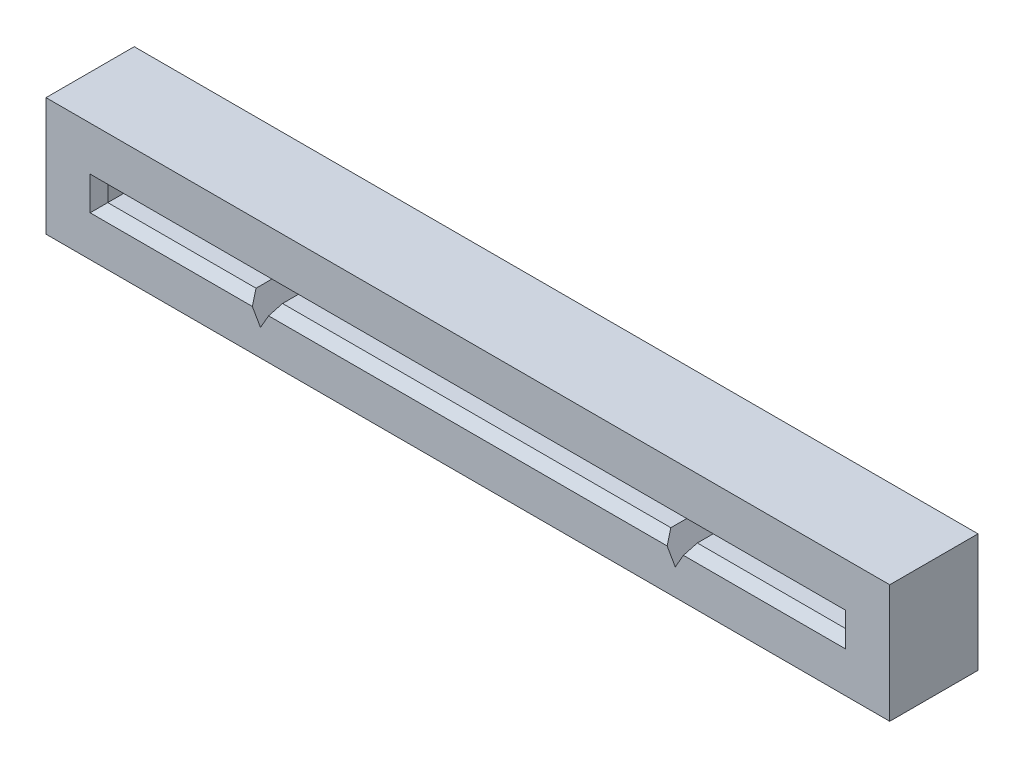
ISO-10303-21;
HEADER;
FILE_DESCRIPTION(('STEP AP214'),'2;1');
FILE_NAME('part.step','',(''),(''),'','','');
FILE_SCHEMA(('AUTOMOTIVE_DESIGN { 1 0 10303 214 1 1 1 1 }'));
ENDSEC;
DATA;
#1=APPLICATION_CONTEXT('core data for automotive mechanical design processes');
#2=APPLICATION_PROTOCOL_DEFINITION('international standard','automotive_design',2000,#1);
#3=PRODUCT_CONTEXT('',#1,'mechanical');
#4=PRODUCT('Part','Part','',(#3));
#5=PRODUCT_RELATED_PRODUCT_CATEGORY('part','',(#4));
#6=PRODUCT_DEFINITION_FORMATION('','',#4);
#7=PRODUCT_DEFINITION_CONTEXT('part definition',#1,'design');
#8=PRODUCT_DEFINITION('design','',#6,#7);
#9=PRODUCT_DEFINITION_SHAPE('','',#8);
#10=(LENGTH_UNIT() NAMED_UNIT(*) SI_UNIT(.MILLI.,.METRE.));
#11=(NAMED_UNIT(*) PLANE_ANGLE_UNIT() SI_UNIT($,.RADIAN.));
#12=(NAMED_UNIT(*) SI_UNIT($,.STERADIAN.) SOLID_ANGLE_UNIT());
#13=UNCERTAINTY_MEASURE_WITH_UNIT(LENGTH_MEASURE(1.E-05),#10,'distance_accuracy_value','');
#14=(GEOMETRIC_REPRESENTATION_CONTEXT(3) GLOBAL_UNCERTAINTY_ASSIGNED_CONTEXT((#13)) GLOBAL_UNIT_ASSIGNED_CONTEXT((#10,
#11,#12)) REPRESENTATION_CONTEXT('',''));
#15=CARTESIAN_POINT('',(0.,0.,0.));
#16=DIRECTION('',(0.,0.,1.));
#17=DIRECTION('',(1.,0.,0.));
#18=AXIS2_PLACEMENT_3D('',#15,#16,#17);
#19=CARTESIAN_POINT('',(0.,0.,5.));
#20=DIRECTION('',(0.,0.,-1.));
#21=DIRECTION('',(-1.,0.,0.));
#22=AXIS2_PLACEMENT_3D('',#19,#20,#21);
#23=PLANE('',#22);
#24=DIRECTION('',(0.499722453489569,-0.866185586048605,0.));
#25=VECTOR('',#24,1.);
#26=CARTESIAN_POINT('',(11.7499999999997,-1.75,5.));
#27=LINE('',#26,#25);
#28=CARTESIAN_POINT('',(11.2884615384613,-0.950000000000006,5.));
#29=VERTEX_POINT('',#28);
#30=CARTESIAN_POINT('',(11.7499999999997,-1.75,5.));
#31=VERTEX_POINT('',#30);
#32=EDGE_CURVE('E187',#29,#31,#27,.T.);
#33=ORIENTED_EDGE('',*,*,#32,.F.);
#34=DIRECTION('',(-1.,0.,0.));
#35=VECTOR('',#34,1.);
#36=CARTESIAN_POINT('',(-11.0000000000002,-0.950000000000006,5.));
#37=LINE('',#36,#35);
#38=CARTESIAN_POINT('',(-11.2884615384618,-0.950000000000007,5.));
#39=VERTEX_POINT('',#38);
#40=EDGE_CURVE('E186',#29,#39,#37,.T.);
#41=ORIENTED_EDGE('',*,*,#40,.T.);
#42=DIRECTION('',(0.499722453489584,0.866185586048597,0.));
#43=VECTOR('',#42,1.);
#44=CARTESIAN_POINT('',(-11.0000000000002,-0.450000000000006,5.));
#45=LINE('',#44,#43);
#46=CARTESIAN_POINT('',(-11.7500000000003,-1.75,5.));
#47=VERTEX_POINT('',#46);
#48=EDGE_CURVE('E170',#47,#39,#45,.T.);
#49=ORIENTED_EDGE('',*,*,#48,.F.);
#50=DIRECTION('',(0.499722453489585,-0.866185586048596,0.));
#51=VECTOR('',#50,1.);
#52=CARTESIAN_POINT('',(-11.7500000000003,-1.75,5.));
#53=LINE('',#52,#51);
#54=CARTESIAN_POINT('',(-12.2115384615387,-0.950000000000006,5.));
#55=VERTEX_POINT('',#54);
#56=EDGE_CURVE('E159',#55,#47,#53,.T.);
#57=ORIENTED_EDGE('',*,*,#56,.F.);
#58=DIRECTION('',(-1.,0.,0.));
#59=VECTOR('',#58,1.);
#60=CARTESIAN_POINT('',(-20.9000000000005,-0.950000000000006,5.));
#61=LINE('',#60,#59);
#62=CARTESIAN_POINT('',(-21.4000000000005,-0.950000000000006,5.));
#63=VERTEX_POINT('',#62);
#64=EDGE_CURVE('E279',#55,#63,#61,.T.);
#65=ORIENTED_EDGE('',*,*,#64,.T.);
#66=DIRECTION('',(0.,1.,0.));
#67=VECTOR('',#66,1.);
#68=CARTESIAN_POINT('',(-21.4000000000005,0.44999999999999,5.));
#69=LINE('',#68,#67);
#70=CARTESIAN_POINT('',(-21.4000000000005,0.949999999999993,5.));
#71=VERTEX_POINT('',#70);
#72=EDGE_CURVE('E277',#63,#71,#69,.T.);
#73=ORIENTED_EDGE('',*,*,#72,.T.);
#74=DIRECTION('',(1.,0.,0.));
#75=VECTOR('',#74,1.);
#76=CARTESIAN_POINT('',(20.8999999999995,0.949999999999993,5.));
#77=LINE('',#76,#75);
#78=CARTESIAN_POINT('',(21.3999999999995,0.949999999999993,5.));
#79=VERTEX_POINT('',#78);
#80=EDGE_CURVE('E271',#71,#79,#77,.T.);
#81=ORIENTED_EDGE('',*,*,#80,.T.);
#82=DIRECTION('',(0.,-1.,0.));
#83=VECTOR('',#82,1.);
#84=CARTESIAN_POINT('',(21.3999999999995,-0.449999999999992,5.));
#85=LINE('',#84,#83);
#86=CARTESIAN_POINT('',(21.3999999999995,-0.949999999999993,5.));
#87=VERTEX_POINT('',#86);
#88=EDGE_CURVE('E273',#79,#87,#85,.T.);
#89=ORIENTED_EDGE('',*,*,#88,.T.);
#90=DIRECTION('',(-1.,0.,0.));
#91=VECTOR('',#90,1.);
#92=CARTESIAN_POINT('',(12.4999999999998,-0.949999999999993,5.));
#93=LINE('',#92,#91);
#94=CARTESIAN_POINT('',(12.2115384615382,-0.949999999999993,5.));
#95=VERTEX_POINT('',#94);
#96=EDGE_CURVE('E275',#87,#95,#93,.T.);
#97=ORIENTED_EDGE('',*,*,#96,.T.);
#98=DIRECTION('',(0.499722453489582,0.866185586048597,0.));
#99=VECTOR('',#98,1.);
#100=CARTESIAN_POINT('',(12.4999999999998,-0.449999999999992,5.));
#101=LINE('',#100,#99);
#102=EDGE_CURVE('E171',#31,#95,#101,.T.);
#103=ORIENTED_EDGE('',*,*,#102,.F.);
#104=EDGE_LOOP('',(#33,#41,#49,#57,#65,#73,#81,#89,#97,#103));
#105=FACE_BOUND('',#104,.T.);
#106=DIRECTION('',(0.,-1.,0.));
#107=VECTOR('',#106,1.);
#108=CARTESIAN_POINT('',(-23.8999999999999,3.44999999999999,5.));
#109=LINE('',#108,#107);
#110=CARTESIAN_POINT('',(-23.8999999999999,3.44999999999999,5.));
#111=VERTEX_POINT('',#110);
#112=CARTESIAN_POINT('',(-23.8999999999999,-3.24999999999999,5.));
#113=VERTEX_POINT('',#112);
#114=EDGE_CURVE('E237',#111,#113,#109,.T.);
#115=ORIENTED_EDGE('',*,*,#114,.T.);
#116=DIRECTION('',(1.,0.,0.));
#117=VECTOR('',#116,1.);
#118=CARTESIAN_POINT('',(23.8999999999995,-3.24999999999999,5.));
#119=LINE('',#118,#117);
#120=CARTESIAN_POINT('',(23.8999999999995,-3.24999999999999,5.));
#121=VERTEX_POINT('',#120);
#122=EDGE_CURVE('E240',#113,#121,#119,.T.);
#123=ORIENTED_EDGE('',*,*,#122,.T.);
#124=DIRECTION('',(0.,1.,0.));
#125=VECTOR('',#124,1.);
#126=CARTESIAN_POINT('',(23.8999999999995,3.44999999999999,5.));
#127=LINE('',#126,#125);
#128=CARTESIAN_POINT('',(23.8999999999995,3.44999999999999,5.));
#129=VERTEX_POINT('',#128);
#130=EDGE_CURVE('E243',#121,#129,#127,.T.);
#131=ORIENTED_EDGE('',*,*,#130,.T.);
#132=DIRECTION('',(-1.,0.,0.));
#133=VECTOR('',#132,1.);
#134=CARTESIAN_POINT('',(23.8999999999995,3.44999999999999,5.));
#135=LINE('',#134,#133);
#136=EDGE_CURVE('E245',#129,#111,#135,.T.);
#137=ORIENTED_EDGE('',*,*,#136,.T.);
#138=EDGE_LOOP('',(#115,#123,#131,#137));
#139=FACE_BOUND('',#138,.T.);
#140=ADVANCED_FACE('F34',(#105,#139),#23,.F.);
#141=CARTESIAN_POINT('',(0.,0.,0.));
#142=DIRECTION('',(0.,0.,-1.));
#143=DIRECTION('',(-1.,0.,0.));
#144=AXIS2_PLACEMENT_3D('',#141,#142,#143);
#145=PLANE('',#144);
#146=DIRECTION('',(0.,-1.,0.));
#147=VECTOR('',#146,1.);
#148=CARTESIAN_POINT('',(-23.8999999999999,3.44999999999999,0.));
#149=LINE('',#148,#147);
#150=CARTESIAN_POINT('',(-23.8999999999999,3.44999999999999,0.));
#151=VERTEX_POINT('',#150);
#152=CARTESIAN_POINT('',(-23.8999999999999,-3.24999999999999,0.));
#153=VERTEX_POINT('',#152);
#154=EDGE_CURVE('E236',#151,#153,#149,.T.);
#155=ORIENTED_EDGE('',*,*,#154,.F.);
#156=DIRECTION('',(-1.,0.,0.));
#157=VECTOR('',#156,1.);
#158=CARTESIAN_POINT('',(23.8999999999995,3.44999999999999,0.));
#159=LINE('',#158,#157);
#160=CARTESIAN_POINT('',(23.8999999999995,3.44999999999999,0.));
#161=VERTEX_POINT('',#160);
#162=EDGE_CURVE('E241',#161,#151,#159,.T.);
#163=ORIENTED_EDGE('',*,*,#162,.F.);
#164=DIRECTION('',(0.,1.,0.));
#165=VECTOR('',#164,1.);
#166=CARTESIAN_POINT('',(23.8999999999995,3.44999999999999,0.));
#167=LINE('',#166,#165);
#168=CARTESIAN_POINT('',(23.8999999999995,-3.24999999999999,0.));
#169=VERTEX_POINT('',#168);
#170=EDGE_CURVE('E252',#169,#161,#167,.T.);
#171=ORIENTED_EDGE('',*,*,#170,.F.);
#172=DIRECTION('',(1.,0.,0.));
#173=VECTOR('',#172,1.);
#174=CARTESIAN_POINT('',(23.8999999999995,-3.24999999999999,0.));
#175=LINE('',#174,#173);
#176=EDGE_CURVE('E250',#153,#169,#175,.T.);
#177=ORIENTED_EDGE('',*,*,#176,.F.);
#178=EDGE_LOOP('',(#155,#163,#171,#177));
#179=FACE_BOUND('',#178,.T.);
#180=DIRECTION('',(0.499722453489569,-0.866185586048605,0.));
#181=VECTOR('',#180,1.);
#182=CARTESIAN_POINT('',(11.7499999999997,-1.75,0.));
#183=LINE('',#182,#181);
#184=CARTESIAN_POINT('',(10.9999999999998,-0.450000000000006,0.));
#185=VERTEX_POINT('',#184);
#186=CARTESIAN_POINT('',(11.7499999999997,-1.75,0.));
#187=VERTEX_POINT('',#186);
#188=EDGE_CURVE('E217',#185,#187,#183,.T.);
#189=ORIENTED_EDGE('',*,*,#188,.T.);
#190=DIRECTION('',(0.499722453489582,0.866185586048597,0.));
#191=VECTOR('',#190,1.);
#192=CARTESIAN_POINT('',(12.4999999999998,-0.449999999999992,0.));
#193=LINE('',#192,#191);
#194=CARTESIAN_POINT('',(12.4999999999998,-0.449999999999992,0.));
#195=VERTEX_POINT('',#194);
#196=EDGE_CURVE('E193',#187,#195,#193,.T.);
#197=ORIENTED_EDGE('',*,*,#196,.T.);
#198=DIRECTION('',(1.,0.,0.));
#199=VECTOR('',#198,1.);
#200=CARTESIAN_POINT('',(20.8999999999995,-0.449999999999992,0.));
#201=LINE('',#200,#199);
#202=CARTESIAN_POINT('',(20.8999999999995,-0.449999999999992,0.));
#203=VERTEX_POINT('',#202);
#204=EDGE_CURVE('E196',#195,#203,#201,.T.);
#205=ORIENTED_EDGE('',*,*,#204,.T.);
#206=DIRECTION('',(0.,1.,0.));
#207=VECTOR('',#206,1.);
#208=CARTESIAN_POINT('',(20.8999999999995,-0.449999999999992,0.));
#209=LINE('',#208,#207);
#210=CARTESIAN_POINT('',(20.8999999999995,0.449999999999992,0.));
#211=VERTEX_POINT('',#210);
#212=EDGE_CURVE('E199',#203,#211,#209,.T.);
#213=ORIENTED_EDGE('',*,*,#212,.T.);
#214=DIRECTION('',(-1.,0.,0.));
#215=VECTOR('',#214,1.);
#216=CARTESIAN_POINT('',(20.8999999999995,0.449999999999992,0.));
#217=LINE('',#216,#215);
#218=CARTESIAN_POINT('',(-20.9000000000005,0.449999999999992,0.));
#219=VERTEX_POINT('',#218);
#220=EDGE_CURVE('E202',#211,#219,#217,.T.);
#221=ORIENTED_EDGE('',*,*,#220,.T.);
#222=DIRECTION('',(0.,-1.,0.));
#223=VECTOR('',#222,1.);
#224=CARTESIAN_POINT('',(-20.9000000000005,-0.450000000000006,0.));
#225=LINE('',#224,#223);
#226=CARTESIAN_POINT('',(-20.9000000000005,-0.450000000000006,0.));
#227=VERTEX_POINT('',#226);
#228=EDGE_CURVE('E205',#219,#227,#225,.T.);
#229=ORIENTED_EDGE('',*,*,#228,.T.);
#230=DIRECTION('',(1.,0.,0.));
#231=VECTOR('',#230,1.);
#232=CARTESIAN_POINT('',(-12.5000000000003,-0.450000000000006,0.));
#233=LINE('',#232,#231);
#234=CARTESIAN_POINT('',(-12.5000000000003,-0.450000000000006,0.));
#235=VERTEX_POINT('',#234);
#236=EDGE_CURVE('E208',#227,#235,#233,.T.);
#237=ORIENTED_EDGE('',*,*,#236,.T.);
#238=DIRECTION('',(0.499722453489585,-0.866185586048596,0.));
#239=VECTOR('',#238,1.);
#240=CARTESIAN_POINT('',(-11.7500000000003,-1.75,0.));
#241=LINE('',#240,#239);
#242=CARTESIAN_POINT('',(-11.7500000000003,-1.75,0.));
#243=VERTEX_POINT('',#242);
#244=EDGE_CURVE('E211',#235,#243,#241,.T.);
#245=ORIENTED_EDGE('',*,*,#244,.T.);
#246=DIRECTION('',(0.499722453489584,0.866185586048597,0.));
#247=VECTOR('',#246,1.);
#248=CARTESIAN_POINT('',(-11.0000000000002,-0.450000000000006,0.));
#249=LINE('',#248,#247);
#250=CARTESIAN_POINT('',(-11.0000000000002,-0.450000000000006,0.));
#251=VERTEX_POINT('',#250);
#252=EDGE_CURVE('E178',#243,#251,#249,.T.);
#253=ORIENTED_EDGE('',*,*,#252,.T.);
#254=DIRECTION('',(1.,0.,0.));
#255=VECTOR('',#254,1.);
#256=CARTESIAN_POINT('',(10.9999999999998,-0.450000000000006,0.));
#257=LINE('',#256,#255);
#258=EDGE_CURVE('E214',#251,#185,#257,.T.);
#259=ORIENTED_EDGE('',*,*,#258,.T.);
#260=EDGE_LOOP('',(#189,#197,#205,#213,#221,#229,#237,#245,#253,#259));
#261=FACE_BOUND('',#260,.T.);
#262=ADVANCED_FACE('F323',(#179,#261),#145,.T.);
#263=CARTESIAN_POINT('',(-23.8999999999999,3.44999999999999,5.));
#264=DIRECTION('',(1.,0.,0.));
#265=DIRECTION('',(0.,0.,-1.));
#266=AXIS2_PLACEMENT_3D('',#263,#264,#265);
#267=PLANE('',#266);
#268=ORIENTED_EDGE('',*,*,#154,.T.);
#269=DIRECTION('',(0.,0.,-1.));
#270=VECTOR('',#269,1.);
#271=CARTESIAN_POINT('',(-23.8999999999999,-3.24999999999999,5.));
#272=LINE('',#271,#270);
#273=EDGE_CURVE('E263',#113,#153,#272,.T.);
#274=ORIENTED_EDGE('',*,*,#273,.F.);
#275=ORIENTED_EDGE('',*,*,#114,.F.);
#276=DIRECTION('',(0.,0.,-1.));
#277=VECTOR('',#276,1.);
#278=CARTESIAN_POINT('',(-23.8999999999999,3.44999999999999,5.));
#279=LINE('',#278,#277);
#280=EDGE_CURVE('E247',#111,#151,#279,.T.);
#281=ORIENTED_EDGE('',*,*,#280,.T.);
#282=EDGE_LOOP('',(#268,#274,#275,#281));
#283=FACE_BOUND('',#282,.T.);
#284=ADVANCED_FACE('F345',(#283),#267,.F.);
#285=CARTESIAN_POINT('',(23.8999999999995,-3.24999999999999,5.));
#286=DIRECTION('',(0.,1.,0.));
#287=DIRECTION('',(0.,0.,1.));
#288=AXIS2_PLACEMENT_3D('',#285,#286,#287);
#289=PLANE('',#288);
#290=ORIENTED_EDGE('',*,*,#176,.T.);
#291=DIRECTION('',(0.,0.,-1.));
#292=VECTOR('',#291,1.);
#293=CARTESIAN_POINT('',(23.8999999999995,-3.24999999999999,5.));
#294=LINE('',#293,#292);
#295=EDGE_CURVE('E260',#121,#169,#294,.T.);
#296=ORIENTED_EDGE('',*,*,#295,.F.);
#297=ORIENTED_EDGE('',*,*,#122,.F.);
#298=ORIENTED_EDGE('',*,*,#273,.T.);
#299=EDGE_LOOP('',(#290,#296,#297,#298));
#300=FACE_BOUND('',#299,.T.);
#301=ADVANCED_FACE('F358',(#300),#289,.F.);
#302=CARTESIAN_POINT('',(23.8999999999995,3.44999999999999,5.));
#303=DIRECTION('',(-1.,0.,0.));
#304=DIRECTION('',(0.,0.,1.));
#305=AXIS2_PLACEMENT_3D('',#302,#303,#304);
#306=PLANE('',#305);
#307=ORIENTED_EDGE('',*,*,#170,.T.);
#308=DIRECTION('',(0.,0.,-1.));
#309=VECTOR('',#308,1.);
#310=CARTESIAN_POINT('',(23.8999999999995,3.44999999999999,5.));
#311=LINE('',#310,#309);
#312=EDGE_CURVE('E257',#129,#161,#311,.T.);
#313=ORIENTED_EDGE('',*,*,#312,.F.);
#314=ORIENTED_EDGE('',*,*,#130,.F.);
#315=ORIENTED_EDGE('',*,*,#295,.T.);
#316=EDGE_LOOP('',(#307,#313,#314,#315));
#317=FACE_BOUND('',#316,.T.);
#318=ADVANCED_FACE('F354',(#317),#306,.F.);
#319=CARTESIAN_POINT('',(23.8999999999995,3.44999999999999,5.));
#320=DIRECTION('',(0.,-1.,0.));
#321=DIRECTION('',(0.,0.,-1.));
#322=AXIS2_PLACEMENT_3D('',#319,#320,#321);
#323=PLANE('',#322);
#324=ORIENTED_EDGE('',*,*,#162,.T.);
#325=ORIENTED_EDGE('',*,*,#280,.F.);
#326=ORIENTED_EDGE('',*,*,#136,.F.);
#327=ORIENTED_EDGE('',*,*,#312,.T.);
#328=EDGE_LOOP('',(#324,#325,#326,#327));
#329=FACE_BOUND('',#328,.T.);
#330=ADVANCED_FACE('F351',(#329),#323,.F.);
#331=CARTESIAN_POINT('',(12.4999999999998,-0.449999999999992,5.));
#332=DIRECTION('',(-0.866185586048597,0.499722453489583,0.));
#333=DIRECTION('',(-0.499722453489583,-0.866185586048597,0.));
#334=AXIS2_PLACEMENT_3D('',#331,#332,#333);
#335=PLANE('',#334);
#336=ORIENTED_EDGE('',*,*,#102,.T.);
#337=DIRECTION('',(0.377724723874414,0.654722854715641,-0.654722854715641));
#338=VECTOR('',#337,1.);
#339=CARTESIAN_POINT('',(12.3763474952439,-0.664331008243492,4.7143310082435));
#340=LINE('',#339,#338);
#341=CARTESIAN_POINT('',(12.4999999999998,-0.449999999999992,4.5));
#342=VERTEX_POINT('',#341);
#343=EDGE_CURVE('E291',#95,#342,#340,.T.);
#344=ORIENTED_EDGE('',*,*,#343,.T.);
#345=DIRECTION('',(0.,0.,-1.));
#346=VECTOR('',#345,1.);
#347=CARTESIAN_POINT('',(12.4999999999998,-0.449999999999992,5.));
#348=LINE('',#347,#346);
#349=EDGE_CURVE('E234',#342,#195,#348,.T.);
#350=ORIENTED_EDGE('',*,*,#349,.T.);
#351=ORIENTED_EDGE('',*,*,#196,.F.);
#352=DIRECTION('',(0.,0.,-1.));
#353=VECTOR('',#352,1.);
#354=CARTESIAN_POINT('',(11.7499999999997,-1.75,5.));
#355=LINE('',#354,#353);
#356=EDGE_CURVE('E189',#31,#187,#355,.T.);
#357=ORIENTED_EDGE('',*,*,#356,.F.);
#358=EDGE_LOOP('',(#336,#344,#350,#351,#357));
#359=FACE_BOUND('',#358,.T.);
#360=ADVANCED_FACE('F317',(#359),#335,.T.);
#361=CARTESIAN_POINT('',(20.8999999999995,-0.449999999999992,5.));
#362=DIRECTION('',(0.,1.,0.));
#363=DIRECTION('',(0.,0.,1.));
#364=AXIS2_PLACEMENT_3D('',#361,#362,#363);
#365=PLANE('',#364);
#366=ORIENTED_EDGE('',*,*,#349,.F.);
#367=DIRECTION('',(1.,0.,0.));
#368=VECTOR('',#367,1.);
#369=CARTESIAN_POINT('',(20.8999999999995,-0.449999999999992,4.5));
#370=LINE('',#369,#368);
#371=CARTESIAN_POINT('',(20.8999999999995,-0.449999999999992,4.5));
#372=VERTEX_POINT('',#371);
#373=EDGE_CURVE('E58',#342,#372,#370,.T.);
#374=ORIENTED_EDGE('',*,*,#373,.T.);
#375=DIRECTION('',(0.,0.,-1.));
#376=VECTOR('',#375,1.);
#377=CARTESIAN_POINT('',(20.8999999999995,-0.449999999999992,5.));
#378=LINE('',#377,#376);
#379=EDGE_CURVE('E232',#372,#203,#378,.T.);
#380=ORIENTED_EDGE('',*,*,#379,.T.);
#381=ORIENTED_EDGE('',*,*,#204,.F.);
#382=EDGE_LOOP('',(#366,#374,#380,#381));
#383=FACE_BOUND('',#382,.T.);
#384=ADVANCED_FACE('F396',(#383),#365,.T.);
#385=CARTESIAN_POINT('',(20.8999999999995,-0.449999999999992,5.));
#386=DIRECTION('',(-1.,0.,0.));
#387=DIRECTION('',(0.,0.,1.));
#388=AXIS2_PLACEMENT_3D('',#385,#386,#387);
#389=PLANE('',#388);
#390=ORIENTED_EDGE('',*,*,#379,.F.);
#391=DIRECTION('',(0.,1.,0.));
#392=VECTOR('',#391,1.);
#393=CARTESIAN_POINT('',(20.8999999999995,0.449999999999992,4.5));
#394=LINE('',#393,#392);
#395=CARTESIAN_POINT('',(20.8999999999995,0.449999999999992,4.5));
#396=VERTEX_POINT('',#395);
#397=EDGE_CURVE('E43',#372,#396,#394,.T.);
#398=ORIENTED_EDGE('',*,*,#397,.T.);
#399=DIRECTION('',(0.,0.,-1.));
#400=VECTOR('',#399,1.);
#401=CARTESIAN_POINT('',(20.8999999999995,0.449999999999992,5.));
#402=LINE('',#401,#400);
#403=EDGE_CURVE('E230',#396,#211,#402,.T.);
#404=ORIENTED_EDGE('',*,*,#403,.T.);
#405=ORIENTED_EDGE('',*,*,#212,.F.);
#406=EDGE_LOOP('',(#390,#398,#404,#405));
#407=FACE_BOUND('',#406,.T.);
#408=ADVANCED_FACE('F402',(#407),#389,.T.);
#409=CARTESIAN_POINT('',(20.8999999999995,0.449999999999992,5.));
#410=DIRECTION('',(0.,-1.,0.));
#411=DIRECTION('',(0.,0.,-1.));
#412=AXIS2_PLACEMENT_3D('',#409,#410,#411);
#413=PLANE('',#412);
#414=ORIENTED_EDGE('',*,*,#403,.F.);
#415=DIRECTION('',(-1.,0.,0.));
#416=VECTOR('',#415,1.);
#417=CARTESIAN_POINT('',(-20.9000000000005,0.449999999999992,4.5));
#418=LINE('',#417,#416);
#419=CARTESIAN_POINT('',(-20.9000000000005,0.449999999999992,4.5));
#420=VERTEX_POINT('',#419);
#421=EDGE_CURVE('E11',#396,#420,#418,.T.);
#422=ORIENTED_EDGE('',*,*,#421,.T.);
#423=DIRECTION('',(0.,0.,-1.));
#424=VECTOR('',#423,1.);
#425=CARTESIAN_POINT('',(-20.9000000000005,0.449999999999992,5.));
#426=LINE('',#425,#424);
#427=EDGE_CURVE('E228',#420,#219,#426,.T.);
#428=ORIENTED_EDGE('',*,*,#427,.T.);
#429=ORIENTED_EDGE('',*,*,#220,.F.);
#430=EDGE_LOOP('',(#414,#422,#428,#429));
#431=FACE_BOUND('',#430,.T.);
#432=ADVANCED_FACE('F408',(#431),#413,.T.);
#433=CARTESIAN_POINT('',(-20.9000000000005,-0.450000000000006,5.));
#434=DIRECTION('',(1.,0.,0.));
#435=DIRECTION('',(0.,1.,0.));
#436=AXIS2_PLACEMENT_3D('',#433,#434,#435);
#437=PLANE('',#436);
#438=ORIENTED_EDGE('',*,*,#427,.F.);
#439=DIRECTION('',(0.,-1.,0.));
#440=VECTOR('',#439,1.);
#441=CARTESIAN_POINT('',(-20.9000000000005,-0.450000000000006,4.5));
#442=LINE('',#441,#440);
#443=CARTESIAN_POINT('',(-20.9000000000005,-0.450000000000006,4.5));
#444=VERTEX_POINT('',#443);
#445=EDGE_CURVE('E288',#420,#444,#442,.T.);
#446=ORIENTED_EDGE('',*,*,#445,.T.);
#447=DIRECTION('',(0.,0.,-1.));
#448=VECTOR('',#447,1.);
#449=CARTESIAN_POINT('',(-20.9000000000005,-0.450000000000006,5.));
#450=LINE('',#449,#448);
#451=EDGE_CURVE('E226',#444,#227,#450,.T.);
#452=ORIENTED_EDGE('',*,*,#451,.T.);
#453=ORIENTED_EDGE('',*,*,#228,.F.);
#454=EDGE_LOOP('',(#438,#446,#452,#453));
#455=FACE_BOUND('',#454,.T.);
#456=ADVANCED_FACE('F415',(#455),#437,.T.);
#457=CARTESIAN_POINT('',(-12.5000000000003,-0.450000000000006,5.));
#458=DIRECTION('',(0.,1.,0.));
#459=DIRECTION('',(0.,0.,1.));
#460=AXIS2_PLACEMENT_3D('',#457,#458,#459);
#461=PLANE('',#460);
#462=ORIENTED_EDGE('',*,*,#451,.F.);
#463=DIRECTION('',(1.,0.,0.));
#464=VECTOR('',#463,1.);
#465=CARTESIAN_POINT('',(-12.5000000000003,-0.450000000000006,4.5));
#466=LINE('',#465,#464);
#467=CARTESIAN_POINT('',(-12.5000000000003,-0.450000000000006,4.5));
#468=VERTEX_POINT('',#467);
#469=EDGE_CURVE('E284',#444,#468,#466,.T.);
#470=ORIENTED_EDGE('',*,*,#469,.T.);
#471=DIRECTION('',(0.,0.,-1.));
#472=VECTOR('',#471,1.);
#473=CARTESIAN_POINT('',(-12.5000000000003,-0.450000000000006,5.));
#474=LINE('',#473,#472);
#475=EDGE_CURVE('E180',#468,#235,#474,.T.);
#476=ORIENTED_EDGE('',*,*,#475,.T.);
#477=ORIENTED_EDGE('',*,*,#236,.F.);
#478=EDGE_LOOP('',(#462,#470,#476,#477));
#479=FACE_BOUND('',#478,.T.);
#480=ADVANCED_FACE('F423',(#479),#461,.T.);
#481=CARTESIAN_POINT('',(-11.7500000000003,-1.75,5.));
#482=DIRECTION('',(0.866185586048596,0.499722453489585,0.));
#483=DIRECTION('',(-0.499722453489585,0.866185586048596,0.));
#484=AXIS2_PLACEMENT_3D('',#481,#482,#483);
#485=PLANE('',#484);
#486=ORIENTED_EDGE('',*,*,#475,.F.);
#487=DIRECTION('',(0.377724723874416,-0.654722854715641,0.654722854715641));
#488=VECTOR('',#487,1.);
#489=CARTESIAN_POINT('',(-11.9478440076096,-1.40707038681041,5.4570703868104));
#490=LINE('',#489,#488);
#491=EDGE_CURVE('E166',#468,#55,#490,.T.);
#492=ORIENTED_EDGE('',*,*,#491,.T.);
#493=ORIENTED_EDGE('',*,*,#56,.T.);
#494=DIRECTION('',(0.,0.,-1.));
#495=VECTOR('',#494,1.);
#496=CARTESIAN_POINT('',(-11.7500000000003,-1.75,5.));
#497=LINE('',#496,#495);
#498=EDGE_CURVE('E164',#47,#243,#497,.T.);
#499=ORIENTED_EDGE('',*,*,#498,.T.);
#500=ORIENTED_EDGE('',*,*,#244,.F.);
#501=EDGE_LOOP('',(#486,#492,#493,#499,#500));
#502=FACE_BOUND('',#501,.T.);
#503=ADVANCED_FACE('F162',(#502),#485,.T.);
#504=CARTESIAN_POINT('',(-11.0000000000002,-0.450000000000006,5.));
#505=DIRECTION('',(-0.866185586048597,0.499722453489584,0.));
#506=DIRECTION('',(-0.499722453489584,-0.866185586048597,0.));
#507=AXIS2_PLACEMENT_3D('',#504,#505,#506);
#508=PLANE('',#507);
#509=ORIENTED_EDGE('',*,*,#48,.T.);
#510=DIRECTION('',(0.377724723874415,0.654722854715641,-0.654722854715641));
#511=VECTOR('',#510,1.);
#512=CARTESIAN_POINT('',(-11.1236525047561,-0.664331008243505,4.7143310082435));
#513=LINE('',#512,#511);
#514=CARTESIAN_POINT('',(-11.0000000000002,-0.450000000000006,4.5));
#515=VERTEX_POINT('',#514);
#516=EDGE_CURVE('E282',#39,#515,#513,.T.);
#517=ORIENTED_EDGE('',*,*,#516,.T.);
#518=DIRECTION('',(0.,0.,-1.));
#519=VECTOR('',#518,1.);
#520=CARTESIAN_POINT('',(-11.0000000000002,-0.450000000000006,5.));
#521=LINE('',#520,#519);
#522=EDGE_CURVE('E181',#515,#251,#521,.T.);
#523=ORIENTED_EDGE('',*,*,#522,.T.);
#524=ORIENTED_EDGE('',*,*,#252,.F.);
#525=ORIENTED_EDGE('',*,*,#498,.F.);
#526=EDGE_LOOP('',(#509,#517,#523,#524,#525));
#527=FACE_BOUND('',#526,.T.);
#528=ADVANCED_FACE('F175',(#527),#508,.T.);
#529=CARTESIAN_POINT('',(10.9999999999998,-0.450000000000006,5.));
#530=DIRECTION('',(0.,1.,0.));
#531=DIRECTION('',(0.,0.,1.));
#532=AXIS2_PLACEMENT_3D('',#529,#530,#531);
#533=PLANE('',#532);
#534=ORIENTED_EDGE('',*,*,#522,.F.);
#535=DIRECTION('',(1.,0.,0.));
#536=VECTOR('',#535,1.);
#537=CARTESIAN_POINT('',(10.9999999999998,-0.450000000000006,4.5));
#538=LINE('',#537,#536);
#539=CARTESIAN_POINT('',(10.9999999999998,-0.450000000000006,4.5));
#540=VERTEX_POINT('',#539);
#541=EDGE_CURVE('E266',#515,#540,#538,.T.);
#542=ORIENTED_EDGE('',*,*,#541,.T.);
#543=DIRECTION('',(0.,0.,-1.));
#544=VECTOR('',#543,1.);
#545=CARTESIAN_POINT('',(10.9999999999998,-0.450000000000006,5.));
#546=LINE('',#545,#544);
#547=EDGE_CURVE('E222',#540,#185,#546,.T.);
#548=ORIENTED_EDGE('',*,*,#547,.T.);
#549=ORIENTED_EDGE('',*,*,#258,.F.);
#550=EDGE_LOOP('',(#534,#542,#548,#549));
#551=FACE_BOUND('',#550,.T.);
#552=ADVANCED_FACE('F327',(#551),#533,.T.);
#553=CARTESIAN_POINT('',(11.7499999999997,-1.75,5.));
#554=DIRECTION('',(0.866185586048605,0.499722453489569,0.));
#555=DIRECTION('',(-0.499722453489569,0.866185586048605,0.));
#556=AXIS2_PLACEMENT_3D('',#553,#554,#555);
#557=PLANE('',#556);
#558=ORIENTED_EDGE('',*,*,#547,.F.);
#559=DIRECTION('',(0.377724723874402,-0.654722854715645,0.654722854715645));
#560=VECTOR('',#559,1.);
#561=CARTESIAN_POINT('',(11.5521559923904,-1.4070703868104,5.4570703868104));
#562=LINE('',#561,#560);
#563=EDGE_CURVE('E269',#540,#29,#562,.T.);
#564=ORIENTED_EDGE('',*,*,#563,.T.);
#565=ORIENTED_EDGE('',*,*,#32,.T.);
#566=ORIENTED_EDGE('',*,*,#356,.T.);
#567=ORIENTED_EDGE('',*,*,#188,.F.);
#568=EDGE_LOOP('',(#558,#564,#565,#566,#567));
#569=FACE_BOUND('',#568,.T.);
#570=ADVANCED_FACE('F321',(#569),#557,.T.);
#571=CARTESIAN_POINT('',(10.9999999999998,-0.450000000000006,4.5));
#572=DIRECTION('',(0.,0.707106781186547,0.707106781186547));
#573=DIRECTION('',(-1.,0.,0.));
#574=AXIS2_PLACEMENT_3D('',#571,#572,#573);
#575=PLANE('',#574);
#576=ORIENTED_EDGE('',*,*,#516,.F.);
#577=ORIENTED_EDGE('',*,*,#40,.F.);
#578=ORIENTED_EDGE('',*,*,#563,.F.);
#579=ORIENTED_EDGE('',*,*,#541,.F.);
#580=EDGE_LOOP('',(#576,#577,#578,#579));
#581=FACE_BOUND('',#580,.T.);
#582=ADVANCED_FACE('F330',(#581),#575,.T.);
#583=CARTESIAN_POINT('',(20.8999999999995,-0.449999999999992,4.5));
#584=DIRECTION('',(0.,0.707106781186547,0.707106781186547));
#585=DIRECTION('',(-1.,0.,0.));
#586=AXIS2_PLACEMENT_3D('',#583,#584,#585);
#587=PLANE('',#586);
#588=ORIENTED_EDGE('',*,*,#343,.F.);
#589=ORIENTED_EDGE('',*,*,#96,.F.);
#590=DIRECTION('',(0.577350269189626,-0.577350269189626,0.577350269189626));
#591=VECTOR('',#590,1.);
#592=CARTESIAN_POINT('',(20.8999999999995,-0.449999999999992,4.5));
#593=LINE('',#592,#591);
#594=EDGE_CURVE('E38',#372,#87,#593,.T.);
#595=ORIENTED_EDGE('',*,*,#594,.F.);
#596=ORIENTED_EDGE('',*,*,#373,.F.);
#597=EDGE_LOOP('',(#588,#589,#595,#596));
#598=FACE_BOUND('',#597,.T.);
#599=ADVANCED_FACE('F36',(#598),#587,.T.);
#600=CARTESIAN_POINT('',(20.8999999999995,-0.449999999999992,4.5));
#601=DIRECTION('',(-0.707106781186547,0.,0.707106781186547));
#602=DIRECTION('',(0.,-1.,0.));
#603=AXIS2_PLACEMENT_3D('',#600,#601,#602);
#604=PLANE('',#603);
#605=ORIENTED_EDGE('',*,*,#594,.T.);
#606=ORIENTED_EDGE('',*,*,#88,.F.);
#607=DIRECTION('',(0.577350269189626,0.577350269189626,0.577350269189626));
#608=VECTOR('',#607,1.);
#609=CARTESIAN_POINT('',(20.5999999999995,0.149999999999997,4.2));
#610=LINE('',#609,#608);
#611=EDGE_CURVE('E299',#396,#79,#610,.T.);
#612=ORIENTED_EDGE('',*,*,#611,.F.);
#613=ORIENTED_EDGE('',*,*,#397,.F.);
#614=EDGE_LOOP('',(#605,#606,#612,#613));
#615=FACE_BOUND('',#614,.T.);
#616=ADVANCED_FACE('F309',(#615),#604,.T.);
#617=CARTESIAN_POINT('',(20.8999999999995,0.449999999999992,4.5));
#618=DIRECTION('',(0.,-0.707106781186547,0.707106781186547));
#619=DIRECTION('',(1.,0.,0.));
#620=AXIS2_PLACEMENT_3D('',#617,#618,#619);
#621=PLANE('',#620);
#622=ORIENTED_EDGE('',*,*,#611,.T.);
#623=ORIENTED_EDGE('',*,*,#80,.F.);
#624=DIRECTION('',(0.577350269189629,-0.577350269189624,-0.577350269189624));
#625=VECTOR('',#624,1.);
#626=CARTESIAN_POINT('',(-20.6000000000005,0.149999999999993,4.2));
#627=LINE('',#626,#625);
#628=EDGE_CURVE('E297',#420,#71,#627,.F.);
#629=ORIENTED_EDGE('',*,*,#628,.F.);
#630=ORIENTED_EDGE('',*,*,#421,.F.);
#631=EDGE_LOOP('',(#622,#623,#629,#630));
#632=FACE_BOUND('',#631,.T.);
#633=ADVANCED_FACE('F473',(#632),#621,.T.);
#634=CARTESIAN_POINT('',(-20.9000000000005,-0.450000000000006,4.5));
#635=DIRECTION('',(0.707106781186546,0.,0.707106781186549));
#636=DIRECTION('',(0.,1.,0.));
#637=AXIS2_PLACEMENT_3D('',#634,#635,#636);
#638=PLANE('',#637);
#639=ORIENTED_EDGE('',*,*,#628,.T.);
#640=ORIENTED_EDGE('',*,*,#72,.F.);
#641=DIRECTION('',(0.577350269189626,0.577350269189626,-0.577350269189626));
#642=VECTOR('',#641,1.);
#643=CARTESIAN_POINT('',(-18.1000000000004,2.35000000000008,1.69999999999991));
#644=LINE('',#643,#642);
#645=EDGE_CURVE('E294',#444,#63,#644,.F.);
#646=ORIENTED_EDGE('',*,*,#645,.F.);
#647=ORIENTED_EDGE('',*,*,#445,.F.);
#648=EDGE_LOOP('',(#639,#640,#646,#647));
#649=FACE_BOUND('',#648,.T.);
#650=ADVANCED_FACE('F481',(#649),#638,.T.);
#651=CARTESIAN_POINT('',(-12.5000000000003,-0.450000000000006,4.5));
#652=DIRECTION('',(0.,0.707106781186547,0.707106781186547));
#653=DIRECTION('',(-1.,0.,0.));
#654=AXIS2_PLACEMENT_3D('',#651,#652,#653);
#655=PLANE('',#654);
#656=ORIENTED_EDGE('',*,*,#645,.T.);
#657=ORIENTED_EDGE('',*,*,#64,.F.);
#658=ORIENTED_EDGE('',*,*,#491,.F.);
#659=ORIENTED_EDGE('',*,*,#469,.F.);
#660=EDGE_LOOP('',(#656,#657,#658,#659));
#661=FACE_BOUND('',#660,.T.);
#662=ADVANCED_FACE('F490',(#661),#655,.T.);
#663=CLOSED_SHELL('',(#140,#262,#284,#301,#318,#330,#360,#384,#408,#432,#456,#480,#503,#528,
#552,#570,#582,#599,#616,#633,#650,#662));
#664=MANIFOLD_SOLID_BREP('B2',#663);
#665=ADVANCED_BREP_SHAPE_REPRESENTATION('',(#18,#664),#14);
#666=SHAPE_DEFINITION_REPRESENTATION(#9,#665);
ENDSEC;
END-ISO-10303-21;
